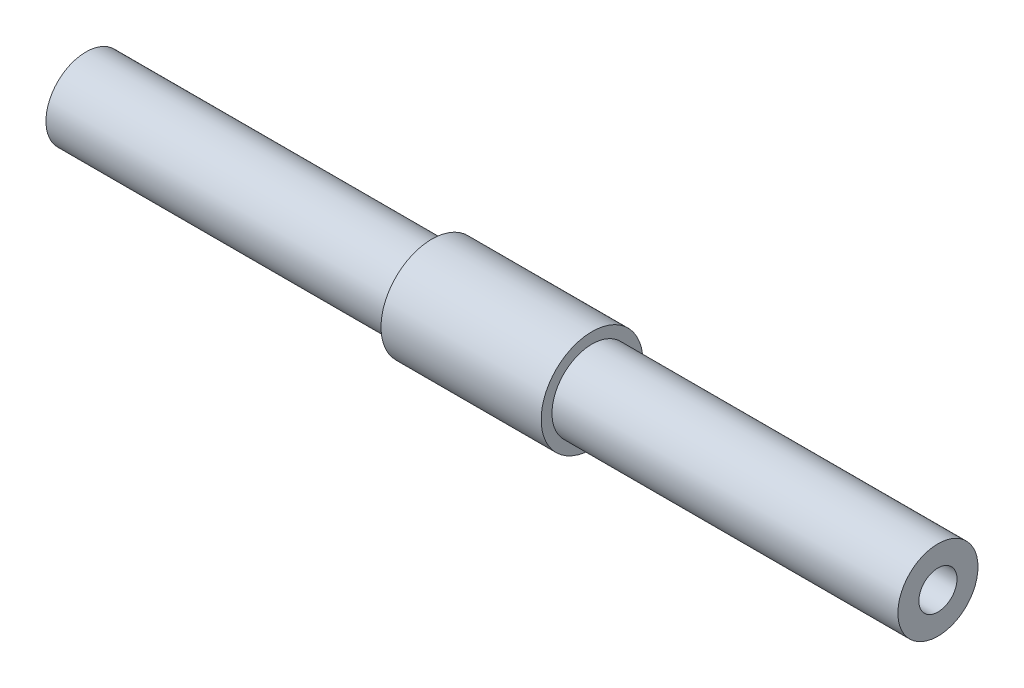
ISO-10303-21;
HEADER;
FILE_DESCRIPTION(('STEP AP214'),'2;1');
FILE_NAME('part.step','',(''),(''),'','','');
FILE_SCHEMA(('AUTOMOTIVE_DESIGN { 1 0 10303 214 1 1 1 1 }'));
ENDSEC;
DATA;
#1=APPLICATION_CONTEXT('core data for automotive mechanical design processes');
#2=APPLICATION_PROTOCOL_DEFINITION('international standard','automotive_design',2000,#1);
#3=PRODUCT_CONTEXT('',#1,'mechanical');
#4=PRODUCT('Part','Part','',(#3));
#5=PRODUCT_RELATED_PRODUCT_CATEGORY('part','',(#4));
#6=PRODUCT_DEFINITION_FORMATION('','',#4);
#7=PRODUCT_DEFINITION_CONTEXT('part definition',#1,'design');
#8=PRODUCT_DEFINITION('design','',#6,#7);
#9=PRODUCT_DEFINITION_SHAPE('','',#8);
#10=(LENGTH_UNIT() NAMED_UNIT(*) SI_UNIT(.MILLI.,.METRE.));
#11=(NAMED_UNIT(*) PLANE_ANGLE_UNIT() SI_UNIT($,.RADIAN.));
#12=(NAMED_UNIT(*) SI_UNIT($,.STERADIAN.) SOLID_ANGLE_UNIT());
#13=UNCERTAINTY_MEASURE_WITH_UNIT(LENGTH_MEASURE(1.E-05),#10,'distance_accuracy_value','');
#14=(GEOMETRIC_REPRESENTATION_CONTEXT(3) GLOBAL_UNCERTAINTY_ASSIGNED_CONTEXT((#13)) GLOBAL_UNIT_ASSIGNED_CONTEXT((#10,
#11,#12)) REPRESENTATION_CONTEXT('',''));
#15=CARTESIAN_POINT('',(0.,0.,0.));
#16=DIRECTION('',(0.,0.,1.));
#17=DIRECTION('',(1.,0.,0.));
#18=AXIS2_PLACEMENT_3D('',#15,#16,#17);
#19=CARTESIAN_POINT('',(53.175,0.,0.));
#20=DIRECTION('',(1.,0.,0.));
#21=DIRECTION('',(0.,0.,-1.));
#22=AXIS2_PLACEMENT_3D('',#19,#20,#21);
#23=CYLINDRICAL_SURFACE('',#22,6.34999999999999);
#24=CARTESIAN_POINT('',(-10.,0.,0.));
#25=DIRECTION('',(1.,0.,0.));
#26=DIRECTION('',(0.,0.,-1.));
#27=AXIS2_PLACEMENT_3D('',#24,#25,#26);
#28=CIRCLE('',#27,6.34999999999999);
#29=CARTESIAN_POINT('',(-10.,0.,-6.34999999999999));
#30=VERTEX_POINT('',#29);
#31=EDGE_CURVE('E10',#30,#30,#28,.T.);
#32=ORIENTED_EDGE('',*,*,#31,.T.);
#33=EDGE_LOOP('',(#32));
#34=FACE_BOUND('',#33,.T.);
#35=CARTESIAN_POINT('',(9.995,0.,0.));
#36=DIRECTION('',(1.,0.,0.));
#37=DIRECTION('',(0.,0.,-1.));
#38=AXIS2_PLACEMENT_3D('',#35,#36,#37);
#39=CIRCLE('',#38,6.34999999999999);
#40=CARTESIAN_POINT('',(9.995,0.,-6.34999999999999));
#41=VERTEX_POINT('',#40);
#42=EDGE_CURVE('E72',#41,#41,#39,.T.);
#43=ORIENTED_EDGE('',*,*,#42,.F.);
#44=EDGE_LOOP('',(#43));
#45=FACE_BOUND('',#44,.T.);
#46=ADVANCED_FACE('F45',(#34,#45),#23,.T.);
#47=CARTESIAN_POINT('',(-10.,0.,0.));
#48=DIRECTION('',(-1.,0.,0.));
#49=DIRECTION('',(0.,0.,1.));
#50=AXIS2_PLACEMENT_3D('',#47,#48,#49);
#51=PLANE('',#50);
#52=CARTESIAN_POINT('',(-10.,0.,0.));
#53=DIRECTION('',(1.,0.,0.));
#54=DIRECTION('',(0.,0.,-1.));
#55=AXIS2_PLACEMENT_3D('',#52,#53,#54);
#56=CIRCLE('',#55,4.99999999999999);
#57=CARTESIAN_POINT('',(-10.,0.,-4.99999999999999));
#58=VERTEX_POINT('',#57);
#59=EDGE_CURVE('E53',#58,#58,#56,.T.);
#60=ORIENTED_EDGE('',*,*,#59,.T.);
#61=EDGE_LOOP('',(#60));
#62=FACE_BOUND('',#61,.T.);
#63=ORIENTED_EDGE('',*,*,#31,.F.);
#64=EDGE_LOOP('',(#63));
#65=FACE_BOUND('',#64,.T.);
#66=ADVANCED_FACE('F112',(#62,#65),#51,.T.);
#67=CARTESIAN_POINT('',(53.175,0.,0.));
#68=DIRECTION('',(1.,0.,0.));
#69=DIRECTION('',(0.,0.,-1.));
#70=AXIS2_PLACEMENT_3D('',#67,#68,#69);
#71=CYLINDRICAL_SURFACE('',#70,4.99999999999999);
#72=ORIENTED_EDGE('',*,*,#59,.F.);
#73=EDGE_LOOP('',(#72));
#74=FACE_BOUND('',#73,.T.);
#75=CARTESIAN_POINT('',(-53.175,0.,0.));
#76=DIRECTION('',(1.,0.,0.));
#77=DIRECTION('',(0.,0.,-1.));
#78=AXIS2_PLACEMENT_3D('',#75,#76,#77);
#79=CIRCLE('',#78,5.);
#80=CARTESIAN_POINT('',(-53.175,0.,-4.99999999999999));
#81=VERTEX_POINT('',#80);
#82=EDGE_CURVE('E58',#81,#81,#79,.T.);
#83=ORIENTED_EDGE('',*,*,#82,.T.);
#84=EDGE_LOOP('',(#83));
#85=FACE_BOUND('',#84,.T.);
#86=ADVANCED_FACE('F116',(#74,#85),#71,.T.);
#87=CARTESIAN_POINT('',(-53.175,0.,0.));
#88=DIRECTION('',(1.,0.,0.));
#89=DIRECTION('',(0.,0.,-1.));
#90=AXIS2_PLACEMENT_3D('',#87,#88,#89);
#91=PLANE('',#90);
#92=CARTESIAN_POINT('',(-53.175,0.,0.));
#93=DIRECTION('',(-1.,0.,0.));
#94=DIRECTION('',(0.,0.,1.));
#95=AXIS2_PLACEMENT_3D('',#92,#93,#94);
#96=CIRCLE('',#95,2.38125);
#97=CARTESIAN_POINT('',(-53.175,0.,2.38125000000002));
#98=VERTEX_POINT('',#97);
#99=EDGE_CURVE('E77',#98,#98,#96,.T.);
#100=ORIENTED_EDGE('',*,*,#99,.F.);
#101=EDGE_LOOP('',(#100));
#102=FACE_BOUND('',#101,.T.);
#103=ORIENTED_EDGE('',*,*,#82,.F.);
#104=EDGE_LOOP('',(#103));
#105=FACE_BOUND('',#104,.T.);
#106=ADVANCED_FACE('F138',(#102,#105),#91,.F.);
#107=CARTESIAN_POINT('',(53.175,0.,0.));
#108=DIRECTION('',(1.,0.,0.));
#109=DIRECTION('',(0.,0.,-1.));
#110=AXIS2_PLACEMENT_3D('',#107,#108,#109);
#111=PLANE('',#110);
#112=CARTESIAN_POINT('',(53.175,0.,0.));
#113=DIRECTION('',(1.,0.,0.));
#114=DIRECTION('',(0.,0.,-1.));
#115=AXIS2_PLACEMENT_3D('',#112,#113,#114);
#116=CIRCLE('',#115,2.38125);
#117=CARTESIAN_POINT('',(53.175,0.,-2.38125000000002));
#118=VERTEX_POINT('',#117);
#119=EDGE_CURVE('E48',#118,#118,#116,.F.);
#120=ORIENTED_EDGE('',*,*,#119,.T.);
#121=EDGE_LOOP('',(#120));
#122=FACE_BOUND('',#121,.T.);
#123=CARTESIAN_POINT('',(53.175,0.,0.));
#124=DIRECTION('',(1.,0.,0.));
#125=DIRECTION('',(0.,0.,-1.));
#126=AXIS2_PLACEMENT_3D('',#123,#124,#125);
#127=CIRCLE('',#126,5.);
#128=CARTESIAN_POINT('',(53.175,0.,-5.00000000000002));
#129=VERTEX_POINT('',#128);
#130=EDGE_CURVE('E64',#129,#129,#127,.T.);
#131=ORIENTED_EDGE('',*,*,#130,.T.);
#132=EDGE_LOOP('',(#131));
#133=FACE_BOUND('',#132,.T.);
#134=ADVANCED_FACE('F93',(#122,#133),#111,.T.);
#135=CARTESIAN_POINT('',(53.175,0.,0.));
#136=DIRECTION('',(1.,0.,0.));
#137=DIRECTION('',(0.,0.,-1.));
#138=AXIS2_PLACEMENT_3D('',#135,#136,#137);
#139=CYLINDRICAL_SURFACE('',#138,5.00000000000001);
#140=CARTESIAN_POINT('',(9.995,0.,0.));
#141=DIRECTION('',(1.,0.,0.));
#142=DIRECTION('',(0.,0.,-1.));
#143=AXIS2_PLACEMENT_3D('',#140,#141,#142);
#144=CIRCLE('',#143,5.00000000000001);
#145=CARTESIAN_POINT('',(9.995,0.,-5.00000000000002));
#146=VERTEX_POINT('',#145);
#147=EDGE_CURVE('E68',#146,#146,#144,.T.);
#148=ORIENTED_EDGE('',*,*,#147,.T.);
#149=EDGE_LOOP('',(#148));
#150=FACE_BOUND('',#149,.T.);
#151=ORIENTED_EDGE('',*,*,#130,.F.);
#152=EDGE_LOOP('',(#151));
#153=FACE_BOUND('',#152,.T.);
#154=ADVANCED_FACE('F123',(#150,#153),#139,.T.);
#155=CARTESIAN_POINT('',(9.995,0.,0.));
#156=DIRECTION('',(-1.,0.,0.));
#157=DIRECTION('',(0.,0.,1.));
#158=AXIS2_PLACEMENT_3D('',#155,#156,#157);
#159=PLANE('',#158);
#160=ORIENTED_EDGE('',*,*,#147,.F.);
#161=EDGE_LOOP('',(#160));
#162=FACE_BOUND('',#161,.T.);
#163=ORIENTED_EDGE('',*,*,#42,.T.);
#164=EDGE_LOOP('',(#163));
#165=FACE_BOUND('',#164,.T.);
#166=ADVANCED_FACE('F121',(#162,#165),#159,.F.);
#167=CARTESIAN_POINT('',(-43.175,0.,0.));
#168=DIRECTION('',(-1.,0.,0.));
#169=DIRECTION('',(0.,0.,1.));
#170=AXIS2_PLACEMENT_3D('',#167,#168,#169);
#171=CYLINDRICAL_SURFACE('',#170,2.38125);
#172=CARTESIAN_POINT('',(-43.175,0.,0.));
#173=DIRECTION('',(-1.,0.,0.));
#174=DIRECTION('',(0.,0.,1.));
#175=AXIS2_PLACEMENT_3D('',#172,#173,#174);
#176=CIRCLE('',#175,2.38125);
#177=CARTESIAN_POINT('',(-43.175,0.,2.38125000000001));
#178=VERTEX_POINT('',#177);
#179=EDGE_CURVE('E76',#178,#178,#176,.T.);
#180=ORIENTED_EDGE('',*,*,#179,.F.);
#181=EDGE_LOOP('',(#180));
#182=FACE_BOUND('',#181,.T.);
#183=ORIENTED_EDGE('',*,*,#99,.T.);
#184=EDGE_LOOP('',(#183));
#185=FACE_BOUND('',#184,.T.);
#186=ADVANCED_FACE('F108',(#182,#185),#171,.F.);
#187=CARTESIAN_POINT('',(-43.175,0.,0.));
#188=DIRECTION('',(-1.,0.,0.));
#189=DIRECTION('',(0.,0.,1.));
#190=AXIS2_PLACEMENT_3D('',#187,#188,#189);
#191=PLANE('',#190);
#192=ORIENTED_EDGE('',*,*,#179,.T.);
#193=EDGE_LOOP('',(#192));
#194=FACE_BOUND('',#193,.T.);
#195=ADVANCED_FACE('F99',(#194),#191,.T.);
#196=CARTESIAN_POINT('',(49.525,0.,0.));
#197=DIRECTION('',(1.,0.,0.));
#198=DIRECTION('',(0.,0.,-1.));
#199=AXIS2_PLACEMENT_3D('',#196,#197,#198);
#200=CYLINDRICAL_SURFACE('',#199,2.38125);
#201=ORIENTED_EDGE('',*,*,#119,.F.);
#202=EDGE_LOOP('',(#201));
#203=FACE_BOUND('',#202,.T.);
#204=CARTESIAN_POINT('',(49.525,0.,0.));
#205=DIRECTION('',(-1.,0.,0.));
#206=DIRECTION('',(0.,0.,1.));
#207=AXIS2_PLACEMENT_3D('',#204,#205,#206);
#208=CIRCLE('',#207,2.38125);
#209=CARTESIAN_POINT('',(49.525,0.,2.38124999999998));
#210=VERTEX_POINT('',#209);
#211=EDGE_CURVE('E84',#210,#210,#208,.T.);
#212=ORIENTED_EDGE('',*,*,#211,.T.);
#213=EDGE_LOOP('',(#212));
#214=FACE_BOUND('',#213,.T.);
#215=ADVANCED_FACE('F96',(#203,#214),#200,.F.);
#216=CARTESIAN_POINT('',(49.525,0.,0.));
#217=DIRECTION('',(1.,0.,0.));
#218=DIRECTION('',(0.,0.,1.));
#219=AXIS2_PLACEMENT_3D('',#216,#217,#218);
#220=PLANE('',#219);
#221=ORIENTED_EDGE('',*,*,#211,.F.);
#222=EDGE_LOOP('',(#221));
#223=FACE_BOUND('',#222,.T.);
#224=ADVANCED_FACE('F98',(#223),#220,.T.);
#225=CLOSED_SHELL('',(#46,#66,#86,#106,#134,#154,#166,#186,#195,#215,#224));
#226=MANIFOLD_SOLID_BREP('B2',#225);
#227=ADVANCED_BREP_SHAPE_REPRESENTATION('',(#18,#226),#14);
#228=SHAPE_DEFINITION_REPRESENTATION(#9,#227);
ENDSEC;
END-ISO-10303-21;
